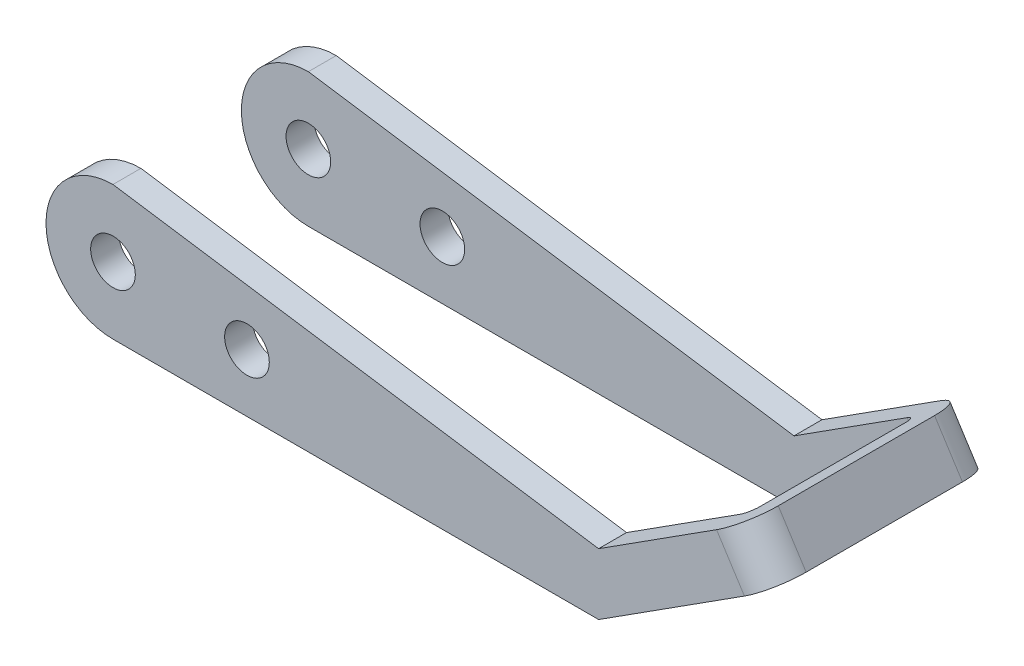
ISO-10303-21;
HEADER;
FILE_DESCRIPTION(('STEP AP214'),'2;1');
FILE_NAME('part.step','',(''),(''),'','','');
FILE_SCHEMA(('AUTOMOTIVE_DESIGN { 1 0 10303 214 1 1 1 1 }'));
ENDSEC;
DATA;
#1=APPLICATION_CONTEXT('core data for automotive mechanical design processes');
#2=APPLICATION_PROTOCOL_DEFINITION('international standard','automotive_design',2000,#1);
#3=PRODUCT_CONTEXT('',#1,'mechanical');
#4=PRODUCT('Part','Part','',(#3));
#5=PRODUCT_RELATED_PRODUCT_CATEGORY('part','',(#4));
#6=PRODUCT_DEFINITION_FORMATION('','',#4);
#7=PRODUCT_DEFINITION_CONTEXT('part definition',#1,'design');
#8=PRODUCT_DEFINITION('design','',#6,#7);
#9=PRODUCT_DEFINITION_SHAPE('','',#8);
#10=(LENGTH_UNIT() NAMED_UNIT(*) SI_UNIT(.MILLI.,.METRE.));
#11=(NAMED_UNIT(*) PLANE_ANGLE_UNIT() SI_UNIT($,.RADIAN.));
#12=(NAMED_UNIT(*) SI_UNIT($,.STERADIAN.) SOLID_ANGLE_UNIT());
#13=UNCERTAINTY_MEASURE_WITH_UNIT(LENGTH_MEASURE(1.E-05),#10,'distance_accuracy_value','');
#14=(GEOMETRIC_REPRESENTATION_CONTEXT(3) GLOBAL_UNCERTAINTY_ASSIGNED_CONTEXT((#13)) GLOBAL_UNIT_ASSIGNED_CONTEXT((#10,
#11,#12)) REPRESENTATION_CONTEXT('',''));
#15=CARTESIAN_POINT('',(0.,0.,0.));
#16=DIRECTION('',(0.,0.,1.));
#17=DIRECTION('',(1.,0.,0.));
#18=AXIS2_PLACEMENT_3D('',#15,#16,#17);
#19=CARTESIAN_POINT('',(54.4833579873411,6.52303191660795,-7.5));
#20=DIRECTION('',(0.842452397007147,0.538770785006864,0.));
#21=DIRECTION('',(-0.538770785006864,0.842452397007147,0.));
#22=AXIS2_PLACEMENT_3D('',#19,#20,#21);
#23=PLANE('',#22);
#24=DIRECTION('',(-0.538770785006864,0.842452397007147,0.));
#25=VECTOR('',#24,1.);
#26=CARTESIAN_POINT('',(56.9792383521143,2.62033256010983,-1.));
#27=LINE('',#26,#25);
#28=CARTESIAN_POINT('',(56.9792383521143,2.62033256010983,-1.));
#29=VERTEX_POINT('',#28);
#30=CARTESIAN_POINT('',(54.4833579873411,6.52303191660795,-1.));
#31=VERTEX_POINT('',#30);
#32=EDGE_CURVE('E228',#29,#31,#27,.T.);
#33=ORIENTED_EDGE('',*,*,#32,.T.);
#34=DIRECTION('',(0.,0.,1.));
#35=VECTOR('',#34,1.);
#36=CARTESIAN_POINT('',(54.4833579873411,6.52303191660795,-7.5));
#37=LINE('',#36,#35);
#38=CARTESIAN_POINT('',(54.4833579873411,6.52303191660795,-14.));
#39=VERTEX_POINT('',#38);
#40=EDGE_CURVE('E247',#39,#31,#37,.T.);
#41=ORIENTED_EDGE('',*,*,#40,.F.);
#42=DIRECTION('',(-0.538770785006864,0.842452397007147,0.));
#43=VECTOR('',#42,1.);
#44=CARTESIAN_POINT('',(56.9792383521143,2.62033256010983,-14.));
#45=LINE('',#44,#43);
#46=CARTESIAN_POINT('',(56.9792383521143,2.62033256010983,-14.));
#47=VERTEX_POINT('',#46);
#48=EDGE_CURVE('E186',#47,#39,#45,.T.);
#49=ORIENTED_EDGE('',*,*,#48,.F.);
#50=DIRECTION('',(0.,0.,1.));
#51=VECTOR('',#50,1.);
#52=CARTESIAN_POINT('',(56.9792383521143,2.62033256010982,-7.5));
#53=LINE('',#52,#51);
#54=EDGE_CURVE('E171',#47,#29,#53,.T.);
#55=ORIENTED_EDGE('',*,*,#54,.T.);
#56=EDGE_LOOP('',(#33,#41,#49,#55));
#57=FACE_BOUND('',#56,.T.);
#58=ADVANCED_FACE('F39',(#57),#23,.F.);
#59=CARTESIAN_POINT('',(0.,0.,0.));
#60=DIRECTION('',(0.,0.,1.));
#61=DIRECTION('',(1.,0.,0.));
#62=AXIS2_PLACEMENT_3D('',#59,#60,#61);
#63=PLANE('',#62);
#64=CARTESIAN_POINT('',(12.,-0.8,0.));
#65=DIRECTION('',(0.,0.,1.));
#66=DIRECTION('',(1.,0.,0.));
#67=AXIS2_PLACEMENT_3D('',#64,#65,#66);
#68=CIRCLE('',#67,2.);
#69=CARTESIAN_POINT('',(14.,-0.8,0.));
#70=VERTEX_POINT('',#69);
#71=EDGE_CURVE('E253',#70,#70,#68,.T.);
#72=ORIENTED_EDGE('',*,*,#71,.T.);
#73=EDGE_LOOP('',(#72));
#74=FACE_BOUND('',#73,.T.);
#75=CARTESIAN_POINT('',(0.,0.,0.));
#76=DIRECTION('',(0.,0.,1.));
#77=DIRECTION('',(1.,0.,0.));
#78=AXIS2_PLACEMENT_3D('',#75,#76,#77);
#79=CIRCLE('',#78,2.);
#80=CARTESIAN_POINT('',(2.,0.,0.));
#81=VERTEX_POINT('',#80);
#82=EDGE_CURVE('E258',#81,#81,#79,.T.);
#83=ORIENTED_EDGE('',*,*,#82,.T.);
#84=EDGE_LOOP('',(#83));
#85=FACE_BOUND('',#84,.T.);
#86=DIRECTION('',(-0.842452397007147,-0.538770785006864,0.));
#87=VECTOR('',#86,1.);
#88=CARTESIAN_POINT('',(43.5,-0.501118558687071,0.));
#89=LINE('',#88,#87);
#90=CARTESIAN_POINT('',(53.640905590334,5.98426113160109,0.));
#91=VERTEX_POINT('',#90);
#92=CARTESIAN_POINT('',(43.5,-0.501118558687071,0.));
#93=VERTEX_POINT('',#92);
#94=EDGE_CURVE('E295',#91,#93,#89,.T.);
#95=ORIENTED_EDGE('',*,*,#94,.F.);
#96=DIRECTION('',(-0.538770785006864,0.842452397007147,0.));
#97=VECTOR('',#96,1.);
#98=CARTESIAN_POINT('',(56.1367859551072,2.08156177510296,0.));
#99=LINE('',#98,#97);
#100=CARTESIAN_POINT('',(56.1367859551072,2.08156177510296,0.));
#101=VERTEX_POINT('',#100);
#102=EDGE_CURVE('E224',#101,#91,#99,.T.);
#103=ORIENTED_EDGE('',*,*,#102,.F.);
#104=DIRECTION('',(0.842452397007147,0.538770785006864,0.));
#105=VECTOR('',#104,1.);
#106=CARTESIAN_POINT('',(43.5,-6.,0.));
#107=LINE('',#106,#105);
#108=CARTESIAN_POINT('',(43.5,-6.,0.));
#109=VERTEX_POINT('',#108);
#110=EDGE_CURVE('E291',#109,#101,#107,.T.);
#111=ORIENTED_EDGE('',*,*,#110,.F.);
#112=DIRECTION('',(1.,0.,0.));
#113=VECTOR('',#112,1.);
#114=CARTESIAN_POINT('',(0.,-6.,0.));
#115=LINE('',#114,#113);
#116=CARTESIAN_POINT('',(0.,-6.,0.));
#117=VERTEX_POINT('',#116);
#118=EDGE_CURVE('E288',#117,#109,#115,.T.);
#119=ORIENTED_EDGE('',*,*,#118,.F.);
#120=CARTESIAN_POINT('',(0.,0.,0.));
#121=DIRECTION('',(0.,0.,1.));
#122=DIRECTION('',(1.,0.,0.));
#123=AXIS2_PLACEMENT_3D('',#120,#121,#122);
#124=CIRCLE('',#123,6.);
#125=CARTESIAN_POINT('',(0.,6.,0.));
#126=VERTEX_POINT('',#125);
#127=EDGE_CURVE('E266',#126,#117,#124,.T.);
#128=ORIENTED_EDGE('',*,*,#127,.F.);
#129=DIRECTION('',(-0.989015863361917,0.147809411129611,0.));
#130=VECTOR('',#129,1.);
#131=CARTESIAN_POINT('',(0.,6.,0.));
#132=LINE('',#131,#130);
#133=EDGE_CURVE('E85',#93,#126,#132,.T.);
#134=ORIENTED_EDGE('',*,*,#133,.F.);
#135=EDGE_LOOP('',(#95,#103,#111,#119,#128,#134));
#136=FACE_BOUND('',#135,.T.);
#137=ADVANCED_FACE('F317',(#74,#85,#136),#63,.F.);
#138=CARTESIAN_POINT('',(0.,0.,2.5));
#139=DIRECTION('',(0.,0.,1.));
#140=DIRECTION('',(1.,0.,0.));
#141=AXIS2_PLACEMENT_3D('',#138,#139,#140);
#142=PLANE('',#141);
#143=DIRECTION('',(-0.538770785006864,0.842452397007147,0.));
#144=VECTOR('',#143,1.);
#145=CARTESIAN_POINT('',(61.0820390122775,-4.72307647523078,2.5));
#146=LINE('',#145,#144);
#147=CARTESIAN_POINT('',(56.5580121536108,2.35094716760639,2.5));
#148=VERTEX_POINT('',#147);
#149=CARTESIAN_POINT('',(54.0621317888375,6.25364652410452,2.5));
#150=VERTEX_POINT('',#149);
#151=EDGE_CURVE('E237',#148,#150,#146,.T.);
#152=ORIENTED_EDGE('',*,*,#151,.T.);
#153=DIRECTION('',(-0.842452397007147,-0.538770785006864,0.));
#154=VECTOR('',#153,1.);
#155=CARTESIAN_POINT('',(43.5,-0.501118558687071,2.5));
#156=LINE('',#155,#154);
#157=CARTESIAN_POINT('',(43.5,-0.501118558687071,2.5));
#158=VERTEX_POINT('',#157);
#159=EDGE_CURVE('E279',#150,#158,#156,.T.);
#160=ORIENTED_EDGE('',*,*,#159,.T.);
#161=DIRECTION('',(-0.989015863361917,0.147809411129611,0.));
#162=VECTOR('',#161,1.);
#163=CARTESIAN_POINT('',(0.,6.,2.5));
#164=LINE('',#163,#162);
#165=CARTESIAN_POINT('',(0.,6.,2.5));
#166=VERTEX_POINT('',#165);
#167=EDGE_CURVE('E64',#158,#166,#164,.T.);
#168=ORIENTED_EDGE('',*,*,#167,.T.);
#169=CARTESIAN_POINT('',(0.,0.,2.5));
#170=DIRECTION('',(0.,0.,1.));
#171=DIRECTION('',(1.,0.,0.));
#172=AXIS2_PLACEMENT_3D('',#169,#170,#171);
#173=CIRCLE('',#172,6.);
#174=CARTESIAN_POINT('',(0.,-6.,2.5));
#175=VERTEX_POINT('',#174);
#176=EDGE_CURVE('E270',#166,#175,#173,.T.);
#177=ORIENTED_EDGE('',*,*,#176,.T.);
#178=DIRECTION('',(1.,0.,0.));
#179=VECTOR('',#178,1.);
#180=CARTESIAN_POINT('',(0.,-6.,2.5));
#181=LINE('',#180,#179);
#182=CARTESIAN_POINT('',(43.5,-6.,2.5));
#183=VERTEX_POINT('',#182);
#184=EDGE_CURVE('E92',#175,#183,#181,.T.);
#185=ORIENTED_EDGE('',*,*,#184,.T.);
#186=DIRECTION('',(0.842452397007147,0.538770785006864,0.));
#187=VECTOR('',#186,1.);
#188=CARTESIAN_POINT('',(43.5,-6.,2.5));
#189=LINE('',#188,#187);
#190=EDGE_CURVE('E275',#183,#148,#189,.T.);
#191=ORIENTED_EDGE('',*,*,#190,.T.);
#192=EDGE_LOOP('',(#152,#160,#168,#177,#185,#191));
#193=FACE_BOUND('',#192,.T.);
#194=CARTESIAN_POINT('',(0.,0.,2.5));
#195=DIRECTION('',(0.,0.,1.));
#196=DIRECTION('',(1.,0.,0.));
#197=AXIS2_PLACEMENT_3D('',#194,#195,#196);
#198=CIRCLE('',#197,2.);
#199=CARTESIAN_POINT('',(2.,0.,2.5));
#200=VERTEX_POINT('',#199);
#201=EDGE_CURVE('E262',#200,#200,#198,.T.);
#202=ORIENTED_EDGE('',*,*,#201,.F.);
#203=EDGE_LOOP('',(#202));
#204=FACE_BOUND('',#203,.T.);
#205=CARTESIAN_POINT('',(12.,-0.8,2.5));
#206=DIRECTION('',(0.,0.,1.));
#207=DIRECTION('',(1.,0.,0.));
#208=AXIS2_PLACEMENT_3D('',#205,#206,#207);
#209=CIRCLE('',#208,2.);
#210=CARTESIAN_POINT('',(14.,-0.8,2.5));
#211=VERTEX_POINT('',#210);
#212=EDGE_CURVE('E254',#211,#211,#209,.T.);
#213=ORIENTED_EDGE('',*,*,#212,.F.);
#214=EDGE_LOOP('',(#213));
#215=FACE_BOUND('',#214,.T.);
#216=ADVANCED_FACE('F400',(#193,#204,#215),#142,.T.);
#217=CARTESIAN_POINT('',(0.,0.,2.5));
#218=DIRECTION('',(0.,0.,-1.));
#219=DIRECTION('',(-1.,0.,0.));
#220=AXIS2_PLACEMENT_3D('',#217,#218,#219);
#221=CYLINDRICAL_SURFACE('',#220,6.);
#222=ORIENTED_EDGE('',*,*,#127,.T.);
#223=DIRECTION('',(0.,0.,-1.));
#224=VECTOR('',#223,1.);
#225=CARTESIAN_POINT('',(0.,-6.,2.5));
#226=LINE('',#225,#224);
#227=EDGE_CURVE('E11',#175,#117,#226,.T.);
#228=ORIENTED_EDGE('',*,*,#227,.F.);
#229=ORIENTED_EDGE('',*,*,#176,.F.);
#230=DIRECTION('',(0.,0.,-1.));
#231=VECTOR('',#230,1.);
#232=CARTESIAN_POINT('',(0.,6.,2.5));
#233=LINE('',#232,#231);
#234=EDGE_CURVE('E284',#166,#126,#233,.T.);
#235=ORIENTED_EDGE('',*,*,#234,.T.);
#236=EDGE_LOOP('',(#222,#228,#229,#235));
#237=FACE_BOUND('',#236,.T.);
#238=ADVANCED_FACE('F41',(#237),#221,.T.);
#239=CARTESIAN_POINT('',(0.,-6.,2.5));
#240=DIRECTION('',(0.,1.,0.));
#241=DIRECTION('',(0.,0.,1.));
#242=AXIS2_PLACEMENT_3D('',#239,#240,#241);
#243=PLANE('',#242);
#244=ORIENTED_EDGE('',*,*,#118,.T.);
#245=DIRECTION('',(0.,0.,-1.));
#246=VECTOR('',#245,1.);
#247=CARTESIAN_POINT('',(43.5,-6.,2.5));
#248=LINE('',#247,#246);
#249=EDGE_CURVE('E48',#183,#109,#248,.T.);
#250=ORIENTED_EDGE('',*,*,#249,.F.);
#251=ORIENTED_EDGE('',*,*,#184,.F.);
#252=ORIENTED_EDGE('',*,*,#227,.T.);
#253=EDGE_LOOP('',(#244,#250,#251,#252));
#254=FACE_BOUND('',#253,.T.);
#255=ADVANCED_FACE('F406',(#254),#243,.F.);
#256=CARTESIAN_POINT('',(43.5,-6.,2.5));
#257=DIRECTION('',(-0.538770785006864,0.842452397007147,0.));
#258=DIRECTION('',(-0.842452397007147,-0.538770785006864,0.));
#259=AXIS2_PLACEMENT_3D('',#256,#257,#258);
#260=PLANE('',#259);
#261=DIRECTION('',(0.,0.,-1.));
#262=VECTOR('',#261,1.);
#263=CARTESIAN_POINT('',(59.0853693446322,3.96725952262698,2.5));
#264=LINE('',#263,#262);
#265=CARTESIAN_POINT('',(59.0853693446322,3.96725952262698,-0.5));
#266=VERTEX_POINT('',#265);
#267=CARTESIAN_POINT('',(59.0853693446322,3.96725952262698,-14.5));
#268=VERTEX_POINT('',#267);
#269=EDGE_CURVE('E308',#266,#268,#264,.T.);
#270=ORIENTED_EDGE('',*,*,#269,.F.);
#271=CARTESIAN_POINT('',(56.5580121536108,2.35094716760639,-0.5));
#272=DIRECTION('',(-0.538770785006864,0.842452397007147,0.));
#273=DIRECTION('',(-0.842452397007147,-0.538770785006864,0.));
#274=AXIS2_PLACEMENT_3D('',#271,#272,#273);
#275=CIRCLE('',#274,3.);
#276=EDGE_CURVE('E240',#266,#148,#275,.F.);
#277=ORIENTED_EDGE('',*,*,#276,.T.);
#278=ORIENTED_EDGE('',*,*,#190,.F.);
#279=ORIENTED_EDGE('',*,*,#249,.T.);
#280=ORIENTED_EDGE('',*,*,#110,.T.);
#281=CARTESIAN_POINT('',(56.1367859551072,2.08156177510296,-1.));
#282=DIRECTION('',(0.538770785006864,-0.842452397007147,0.));
#283=DIRECTION('',(-0.842452397007147,-0.538770785006864,0.));
#284=AXIS2_PLACEMENT_3D('',#281,#282,#283);
#285=CIRCLE('',#284,0.999999999999997);
#286=EDGE_CURVE('E221',#29,#101,#285,.T.);
#287=ORIENTED_EDGE('',*,*,#286,.F.);
#288=ORIENTED_EDGE('',*,*,#54,.F.);
#289=CARTESIAN_POINT('',(56.1367859551072,2.08156177510296,-14.));
#290=DIRECTION('',(-0.538770785006864,0.842452397007147,0.));
#291=DIRECTION('',(-0.842452397007147,-0.538770785006864,0.));
#292=AXIS2_PLACEMENT_3D('',#289,#290,#291);
#293=CIRCLE('',#292,0.999999999999997);
#294=CARTESIAN_POINT('',(56.1367859551072,2.08156177510296,-15.));
#295=VERTEX_POINT('',#294);
#296=EDGE_CURVE('E162',#47,#295,#293,.T.);
#297=ORIENTED_EDGE('',*,*,#296,.T.);
#298=DIRECTION('',(0.842452397007147,0.538770785006864,0.));
#299=VECTOR('',#298,1.);
#300=CARTESIAN_POINT('',(43.5,-6.,-15.));
#301=LINE('',#300,#299);
#302=CARTESIAN_POINT('',(43.5,-6.,-15.));
#303=VERTEX_POINT('',#302);
#304=EDGE_CURVE('E167',#303,#295,#301,.T.);
#305=ORIENTED_EDGE('',*,*,#304,.F.);
#306=DIRECTION('',(0.,0.,1.));
#307=VECTOR('',#306,1.);
#308=CARTESIAN_POINT('',(43.5,-6.,-17.5));
#309=LINE('',#308,#307);
#310=CARTESIAN_POINT('',(43.5,-6.,-17.5));
#311=VERTEX_POINT('',#310);
#312=EDGE_CURVE('E214',#311,#303,#309,.T.);
#313=ORIENTED_EDGE('',*,*,#312,.F.);
#314=DIRECTION('',(0.842452397007147,0.538770785006864,0.));
#315=VECTOR('',#314,1.);
#316=CARTESIAN_POINT('',(43.5,-6.,-17.5));
#317=LINE('',#316,#315);
#318=CARTESIAN_POINT('',(56.5580121536108,2.35094716760639,-17.5));
#319=VERTEX_POINT('',#318);
#320=EDGE_CURVE('E366',#311,#319,#317,.T.);
#321=ORIENTED_EDGE('',*,*,#320,.T.);
#322=CARTESIAN_POINT('',(56.5580121536108,2.35094716760639,-14.5));
#323=DIRECTION('',(0.538770785006864,-0.842452397007147,0.));
#324=DIRECTION('',(-0.842452397007147,-0.538770785006864,0.));
#325=AXIS2_PLACEMENT_3D('',#322,#323,#324);
#326=CIRCLE('',#325,3.);
#327=EDGE_CURVE('E337',#268,#319,#326,.F.);
#328=ORIENTED_EDGE('',*,*,#327,.F.);
#329=EDGE_LOOP('',(#270,#277,#278,#279,#280,#287,#288,#297,#305,#313,#321,#328));
#330=FACE_BOUND('',#329,.T.);
#331=ADVANCED_FACE('F165',(#330),#260,.F.);
#332=CARTESIAN_POINT('',(56.589488979859,7.86995887912511,2.5));
#333=DIRECTION('',(-0.842452397007147,-0.538770785006864,0.));
#334=DIRECTION('',(0.538770785006864,-0.842452397007147,0.));
#335=AXIS2_PLACEMENT_3D('',#332,#333,#334);
#336=PLANE('',#335);
#337=DIRECTION('',(0.,0.,-1.));
#338=VECTOR('',#337,1.);
#339=CARTESIAN_POINT('',(56.589488979859,7.86995887912511,2.5));
#340=LINE('',#339,#338);
#341=CARTESIAN_POINT('',(56.589488979859,7.86995887912511,-0.5));
#342=VERTEX_POINT('',#341);
#343=CARTESIAN_POINT('',(56.589488979859,7.86995887912511,-14.5));
#344=VERTEX_POINT('',#343);
#345=EDGE_CURVE('E305',#342,#344,#340,.T.);
#346=ORIENTED_EDGE('',*,*,#345,.F.);
#347=DIRECTION('',(-0.538770785006864,0.842452397007147,0.));
#348=VECTOR('',#347,1.);
#349=CARTESIAN_POINT('',(63.6093962032989,-3.10676412021019,-0.5));
#350=LINE('',#349,#348);
#351=EDGE_CURVE('E55',#266,#342,#350,.T.);
#352=ORIENTED_EDGE('',*,*,#351,.F.);
#353=ORIENTED_EDGE('',*,*,#269,.T.);
#354=DIRECTION('',(-0.538770785006864,0.842452397007147,0.));
#355=VECTOR('',#354,1.);
#356=CARTESIAN_POINT('',(63.6093962032989,-3.10676412021019,-14.5));
#357=LINE('',#356,#355);
#358=EDGE_CURVE('E333',#268,#344,#357,.T.);
#359=ORIENTED_EDGE('',*,*,#358,.T.);
#360=EDGE_LOOP('',(#346,#352,#353,#359));
#361=FACE_BOUND('',#360,.T.);
#362=ADVANCED_FACE('F399',(#361),#336,.F.);
#363=CARTESIAN_POINT('',(43.5,-0.501118558687071,2.5));
#364=DIRECTION('',(0.538770785006864,-0.842452397007147,0.));
#365=DIRECTION('',(0.842452397007147,0.538770785006864,0.));
#366=AXIS2_PLACEMENT_3D('',#363,#364,#365);
#367=PLANE('',#366);
#368=CARTESIAN_POINT('',(53.640905590334,5.98426113160109,-1.));
#369=DIRECTION('',(0.538770785006864,-0.842452397007147,0.));
#370=DIRECTION('',(-0.842452397007147,-0.538770785006864,0.));
#371=AXIS2_PLACEMENT_3D('',#368,#369,#370);
#372=CIRCLE('',#371,0.999999999999997);
#373=EDGE_CURVE('E220',#31,#91,#372,.T.);
#374=ORIENTED_EDGE('',*,*,#373,.T.);
#375=ORIENTED_EDGE('',*,*,#94,.T.);
#376=DIRECTION('',(0.,0.,-1.));
#377=VECTOR('',#376,1.);
#378=CARTESIAN_POINT('',(43.5,-0.501118558687071,2.5));
#379=LINE('',#378,#377);
#380=EDGE_CURVE('E302',#158,#93,#379,.T.);
#381=ORIENTED_EDGE('',*,*,#380,.F.);
#382=ORIENTED_EDGE('',*,*,#159,.F.);
#383=CARTESIAN_POINT('',(54.0621317888375,6.25364652410452,-0.5));
#384=DIRECTION('',(0.538770785006864,-0.842452397007147,0.));
#385=DIRECTION('',(-0.842452397007147,-0.538770785006864,0.));
#386=AXIS2_PLACEMENT_3D('',#383,#384,#385);
#387=CIRCLE('',#386,3.);
#388=EDGE_CURVE('E232',#342,#150,#387,.T.);
#389=ORIENTED_EDGE('',*,*,#388,.F.);
#390=ORIENTED_EDGE('',*,*,#345,.T.);
#391=CARTESIAN_POINT('',(54.0621317888375,6.25364652410452,-14.5));
#392=DIRECTION('',(-0.538770785006864,0.842452397007147,0.));
#393=DIRECTION('',(-0.842452397007147,-0.538770785006864,0.));
#394=AXIS2_PLACEMENT_3D('',#391,#392,#393);
#395=CIRCLE('',#394,3.);
#396=CARTESIAN_POINT('',(54.0621317888375,6.25364652410452,-17.5));
#397=VERTEX_POINT('',#396);
#398=EDGE_CURVE('E326',#344,#397,#395,.T.);
#399=ORIENTED_EDGE('',*,*,#398,.T.);
#400=DIRECTION('',(-0.842452397007147,-0.538770785006864,0.));
#401=VECTOR('',#400,1.);
#402=CARTESIAN_POINT('',(43.5,-0.501118558687071,-17.5));
#403=LINE('',#402,#401);
#404=CARTESIAN_POINT('',(43.5,-0.501118558687071,-17.5));
#405=VERTEX_POINT('',#404);
#406=EDGE_CURVE('E370',#397,#405,#403,.T.);
#407=ORIENTED_EDGE('',*,*,#406,.T.);
#408=DIRECTION('',(0.,0.,1.));
#409=VECTOR('',#408,1.);
#410=CARTESIAN_POINT('',(43.5,-0.501118558687071,-17.5));
#411=LINE('',#410,#409);
#412=CARTESIAN_POINT('',(43.5,-0.501118558687071,-15.));
#413=VERTEX_POINT('',#412);
#414=EDGE_CURVE('E210',#405,#413,#411,.T.);
#415=ORIENTED_EDGE('',*,*,#414,.T.);
#416=DIRECTION('',(-0.842452397007147,-0.538770785006864,0.));
#417=VECTOR('',#416,1.);
#418=CARTESIAN_POINT('',(43.5,-0.501118558687071,-15.));
#419=LINE('',#418,#417);
#420=CARTESIAN_POINT('',(53.640905590334,5.98426113160109,-15.));
#421=VERTEX_POINT('',#420);
#422=EDGE_CURVE('E193',#421,#413,#419,.T.);
#423=ORIENTED_EDGE('',*,*,#422,.F.);
#424=CARTESIAN_POINT('',(53.640905590334,5.98426113160109,-14.));
#425=DIRECTION('',(-0.538770785006864,0.842452397007147,0.));
#426=DIRECTION('',(-0.842452397007147,-0.538770785006864,0.));
#427=AXIS2_PLACEMENT_3D('',#424,#425,#426);
#428=CIRCLE('',#427,0.999999999999997);
#429=EDGE_CURVE('E177',#39,#421,#428,.T.);
#430=ORIENTED_EDGE('',*,*,#429,.F.);
#431=ORIENTED_EDGE('',*,*,#40,.T.);
#432=EDGE_LOOP('',(#374,#375,#381,#382,#389,#390,#399,#407,#415,#423,#430,#431));
#433=FACE_BOUND('',#432,.T.);
#434=ADVANCED_FACE('F322',(#433),#367,.F.);
#435=CARTESIAN_POINT('',(0.,6.,2.5));
#436=DIRECTION('',(-0.147809411129611,-0.989015863361917,0.));
#437=DIRECTION('',(0.989015863361917,-0.147809411129611,0.));
#438=AXIS2_PLACEMENT_3D('',#435,#436,#437);
#439=PLANE('',#438);
#440=ORIENTED_EDGE('',*,*,#133,.T.);
#441=ORIENTED_EDGE('',*,*,#234,.F.);
#442=ORIENTED_EDGE('',*,*,#167,.F.);
#443=ORIENTED_EDGE('',*,*,#380,.T.);
#444=EDGE_LOOP('',(#440,#441,#442,#443));
#445=FACE_BOUND('',#444,.T.);
#446=ADVANCED_FACE('F431',(#445),#439,.F.);
#447=CARTESIAN_POINT('',(0.,0.,2.5));
#448=DIRECTION('',(0.,0.,-1.));
#449=DIRECTION('',(-1.,0.,0.));
#450=AXIS2_PLACEMENT_3D('',#447,#448,#449);
#451=CYLINDRICAL_SURFACE('',#450,2.);
#452=ORIENTED_EDGE('',*,*,#201,.T.);
#453=EDGE_LOOP('',(#452));
#454=FACE_BOUND('',#453,.T.);
#455=ORIENTED_EDGE('',*,*,#82,.F.);
#456=EDGE_LOOP('',(#455));
#457=FACE_BOUND('',#456,.T.);
#458=ADVANCED_FACE('F427',(#454,#457),#451,.F.);
#459=CARTESIAN_POINT('',(12.,-0.8,2.5));
#460=DIRECTION('',(0.,0.,-1.));
#461=DIRECTION('',(-1.,0.,0.));
#462=AXIS2_PLACEMENT_3D('',#459,#460,#461);
#463=CYLINDRICAL_SURFACE('',#462,2.);
#464=ORIENTED_EDGE('',*,*,#212,.T.);
#465=EDGE_LOOP('',(#464));
#466=FACE_BOUND('',#465,.T.);
#467=ORIENTED_EDGE('',*,*,#71,.F.);
#468=EDGE_LOOP('',(#467));
#469=FACE_BOUND('',#468,.T.);
#470=ADVANCED_FACE('F424',(#466,#469),#463,.F.);
#471=CARTESIAN_POINT('',(61.0820390122775,-4.72307647523078,-0.5));
#472=DIRECTION('',(-0.538770785006864,0.842452397007147,0.));
#473=DIRECTION('',(-0.842452397007147,-0.538770785006864,0.));
#474=AXIS2_PLACEMENT_3D('',#471,#472,#473);
#475=CYLINDRICAL_SURFACE('',#474,3.);
#476=ORIENTED_EDGE('',*,*,#351,.T.);
#477=ORIENTED_EDGE('',*,*,#388,.T.);
#478=ORIENTED_EDGE('',*,*,#151,.F.);
#479=ORIENTED_EDGE('',*,*,#276,.F.);
#480=EDGE_LOOP('',(#476,#477,#478,#479));
#481=FACE_BOUND('',#480,.T.);
#482=ADVANCED_FACE('F422',(#481),#475,.T.);
#483=CARTESIAN_POINT('',(56.1367859551072,2.08156177510296,-1.));
#484=DIRECTION('',(-0.538770785006864,0.842452397007147,0.));
#485=DIRECTION('',(-0.842452397007147,-0.538770785006864,0.));
#486=AXIS2_PLACEMENT_3D('',#483,#484,#485);
#487=CYLINDRICAL_SURFACE('',#486,0.999999999999997);
#488=ORIENTED_EDGE('',*,*,#373,.F.);
#489=ORIENTED_EDGE('',*,*,#32,.F.);
#490=ORIENTED_EDGE('',*,*,#286,.T.);
#491=ORIENTED_EDGE('',*,*,#102,.T.);
#492=EDGE_LOOP('',(#488,#489,#490,#491));
#493=FACE_BOUND('',#492,.T.);
#494=ADVANCED_FACE('F320',(#493),#487,.F.);
#495=CARTESIAN_POINT('',(0.,0.,-15.));
#496=DIRECTION('',(0.,0.,-1.));
#497=DIRECTION('',(1.,0.,0.));
#498=AXIS2_PLACEMENT_3D('',#495,#496,#497);
#499=PLANE('',#498);
#500=CARTESIAN_POINT('',(12.,-0.8,-15.));
#501=DIRECTION('',(0.,0.,1.));
#502=DIRECTION('',(1.,0.,0.));
#503=AXIS2_PLACEMENT_3D('',#500,#501,#502);
#504=CIRCLE('',#503,2.);
#505=CARTESIAN_POINT('',(14.,-0.8,-15.));
#506=VERTEX_POINT('',#505);
#507=EDGE_CURVE('E343',#506,#506,#504,.T.);
#508=ORIENTED_EDGE('',*,*,#507,.F.);
#509=EDGE_LOOP('',(#508));
#510=FACE_BOUND('',#509,.T.);
#511=CARTESIAN_POINT('',(0.,0.,-15.));
#512=DIRECTION('',(0.,0.,1.));
#513=DIRECTION('',(1.,0.,0.));
#514=AXIS2_PLACEMENT_3D('',#511,#512,#513);
#515=CIRCLE('',#514,2.);
#516=CARTESIAN_POINT('',(2.,0.,-15.));
#517=VERTEX_POINT('',#516);
#518=EDGE_CURVE('E348',#517,#517,#515,.T.);
#519=ORIENTED_EDGE('',*,*,#518,.F.);
#520=EDGE_LOOP('',(#519));
#521=FACE_BOUND('',#520,.T.);
#522=ORIENTED_EDGE('',*,*,#422,.T.);
#523=DIRECTION('',(-0.989015863361917,0.147809411129611,0.));
#524=VECTOR('',#523,1.);
#525=CARTESIAN_POINT('',(0.,6.,-15.));
#526=LINE('',#525,#524);
#527=CARTESIAN_POINT('',(0.,6.,-15.));
#528=VERTEX_POINT('',#527);
#529=EDGE_CURVE('E197',#413,#528,#526,.T.);
#530=ORIENTED_EDGE('',*,*,#529,.T.);
#531=CARTESIAN_POINT('',(0.,0.,-15.));
#532=DIRECTION('',(0.,0.,1.));
#533=DIRECTION('',(1.,0.,0.));
#534=AXIS2_PLACEMENT_3D('',#531,#532,#533);
#535=CIRCLE('',#534,6.);
#536=CARTESIAN_POINT('',(0.,-6.,-15.));
#537=VERTEX_POINT('',#536);
#538=EDGE_CURVE('E199',#528,#537,#535,.T.);
#539=ORIENTED_EDGE('',*,*,#538,.T.);
#540=DIRECTION('',(1.,0.,0.));
#541=VECTOR('',#540,1.);
#542=CARTESIAN_POINT('',(0.,-6.,-15.));
#543=LINE('',#542,#541);
#544=EDGE_CURVE('E191',#537,#303,#543,.T.);
#545=ORIENTED_EDGE('',*,*,#544,.T.);
#546=ORIENTED_EDGE('',*,*,#304,.T.);
#547=DIRECTION('',(-0.538770785006864,0.842452397007147,0.));
#548=VECTOR('',#547,1.);
#549=CARTESIAN_POINT('',(56.1367859551072,2.08156177510296,-15.));
#550=LINE('',#549,#548);
#551=EDGE_CURVE('E176',#295,#421,#550,.T.);
#552=ORIENTED_EDGE('',*,*,#551,.T.);
#553=EDGE_LOOP('',(#522,#530,#539,#545,#546,#552));
#554=FACE_BOUND('',#553,.T.);
#555=ADVANCED_FACE('F188',(#510,#521,#554),#499,.F.);
#556=CARTESIAN_POINT('',(0.,0.,-17.5));
#557=DIRECTION('',(0.,0.,-1.));
#558=DIRECTION('',(1.,0.,0.));
#559=AXIS2_PLACEMENT_3D('',#556,#557,#558);
#560=PLANE('',#559);
#561=DIRECTION('',(-0.538770785006864,0.842452397007147,0.));
#562=VECTOR('',#561,1.);
#563=CARTESIAN_POINT('',(61.0820390122775,-4.72307647523078,-17.5));
#564=LINE('',#563,#562);
#565=EDGE_CURVE('E329',#319,#397,#564,.T.);
#566=ORIENTED_EDGE('',*,*,#565,.F.);
#567=ORIENTED_EDGE('',*,*,#320,.F.);
#568=DIRECTION('',(1.,0.,0.));
#569=VECTOR('',#568,1.);
#570=CARTESIAN_POINT('',(0.,-6.,-17.5));
#571=LINE('',#570,#569);
#572=CARTESIAN_POINT('',(0.,-6.,-17.5));
#573=VERTEX_POINT('',#572);
#574=EDGE_CURVE('E362',#573,#311,#571,.T.);
#575=ORIENTED_EDGE('',*,*,#574,.F.);
#576=CARTESIAN_POINT('',(0.,0.,-17.5));
#577=DIRECTION('',(0.,0.,1.));
#578=DIRECTION('',(1.,0.,0.));
#579=AXIS2_PLACEMENT_3D('',#576,#577,#578);
#580=CIRCLE('',#579,6.);
#581=CARTESIAN_POINT('',(0.,6.,-17.5));
#582=VERTEX_POINT('',#581);
#583=EDGE_CURVE('E206',#582,#573,#580,.T.);
#584=ORIENTED_EDGE('',*,*,#583,.F.);
#585=DIRECTION('',(-0.989015863361917,0.147809411129611,0.));
#586=VECTOR('',#585,1.);
#587=CARTESIAN_POINT('',(0.,6.,-17.5));
#588=LINE('',#587,#586);
#589=EDGE_CURVE('E211',#405,#582,#588,.T.);
#590=ORIENTED_EDGE('',*,*,#589,.F.);
#591=ORIENTED_EDGE('',*,*,#406,.F.);
#592=EDGE_LOOP('',(#566,#567,#575,#584,#590,#591));
#593=FACE_BOUND('',#592,.T.);
#594=CARTESIAN_POINT('',(0.,0.,-17.5));
#595=DIRECTION('',(0.,0.,1.));
#596=DIRECTION('',(1.,0.,0.));
#597=AXIS2_PLACEMENT_3D('',#594,#595,#596);
#598=CIRCLE('',#597,2.);
#599=CARTESIAN_POINT('',(2.,0.,-17.5));
#600=VERTEX_POINT('',#599);
#601=EDGE_CURVE('E352',#600,#600,#598,.T.);
#602=ORIENTED_EDGE('',*,*,#601,.T.);
#603=EDGE_LOOP('',(#602));
#604=FACE_BOUND('',#603,.T.);
#605=CARTESIAN_POINT('',(12.,-0.8,-17.5));
#606=DIRECTION('',(0.,0.,1.));
#607=DIRECTION('',(1.,0.,0.));
#608=AXIS2_PLACEMENT_3D('',#605,#606,#607);
#609=CIRCLE('',#608,2.);
#610=CARTESIAN_POINT('',(14.,-0.8,-17.5));
#611=VERTEX_POINT('',#610);
#612=EDGE_CURVE('E344',#611,#611,#609,.T.);
#613=ORIENTED_EDGE('',*,*,#612,.T.);
#614=EDGE_LOOP('',(#613));
#615=FACE_BOUND('',#614,.T.);
#616=ADVANCED_FACE('F390',(#593,#604,#615),#560,.T.);
#617=CARTESIAN_POINT('',(0.,0.,-17.5));
#618=DIRECTION('',(0.,0.,1.));
#619=DIRECTION('',(-1.,0.,0.));
#620=AXIS2_PLACEMENT_3D('',#617,#618,#619);
#621=CYLINDRICAL_SURFACE('',#620,6.);
#622=ORIENTED_EDGE('',*,*,#538,.F.);
#623=DIRECTION('',(0.,0.,1.));
#624=VECTOR('',#623,1.);
#625=CARTESIAN_POINT('',(0.,6.,-17.5));
#626=LINE('',#625,#624);
#627=EDGE_CURVE('E207',#582,#528,#626,.T.);
#628=ORIENTED_EDGE('',*,*,#627,.F.);
#629=ORIENTED_EDGE('',*,*,#583,.T.);
#630=DIRECTION('',(0.,0.,1.));
#631=VECTOR('',#630,1.);
#632=CARTESIAN_POINT('',(0.,-6.,-17.5));
#633=LINE('',#632,#631);
#634=EDGE_CURVE('E217',#573,#537,#633,.T.);
#635=ORIENTED_EDGE('',*,*,#634,.T.);
#636=EDGE_LOOP('',(#622,#628,#629,#635));
#637=FACE_BOUND('',#636,.T.);
#638=ADVANCED_FACE('F380',(#637),#621,.T.);
#639=CARTESIAN_POINT('',(0.,-6.,-17.5));
#640=DIRECTION('',(0.,1.,0.));
#641=DIRECTION('',(0.,0.,-1.));
#642=AXIS2_PLACEMENT_3D('',#639,#640,#641);
#643=PLANE('',#642);
#644=ORIENTED_EDGE('',*,*,#544,.F.);
#645=ORIENTED_EDGE('',*,*,#634,.F.);
#646=ORIENTED_EDGE('',*,*,#574,.T.);
#647=ORIENTED_EDGE('',*,*,#312,.T.);
#648=EDGE_LOOP('',(#644,#645,#646,#647));
#649=FACE_BOUND('',#648,.T.);
#650=ADVANCED_FACE('F384',(#649),#643,.F.);
#651=CARTESIAN_POINT('',(0.,6.,-17.5));
#652=DIRECTION('',(-0.147809411129611,-0.989015863361917,0.));
#653=DIRECTION('',(0.989015863361917,-0.147809411129611,0.));
#654=AXIS2_PLACEMENT_3D('',#651,#652,#653);
#655=PLANE('',#654);
#656=ORIENTED_EDGE('',*,*,#529,.F.);
#657=ORIENTED_EDGE('',*,*,#414,.F.);
#658=ORIENTED_EDGE('',*,*,#589,.T.);
#659=ORIENTED_EDGE('',*,*,#627,.T.);
#660=EDGE_LOOP('',(#656,#657,#658,#659));
#661=FACE_BOUND('',#660,.T.);
#662=ADVANCED_FACE('F505',(#661),#655,.F.);
#663=CARTESIAN_POINT('',(0.,0.,-17.5));
#664=DIRECTION('',(0.,0.,1.));
#665=DIRECTION('',(-1.,0.,0.));
#666=AXIS2_PLACEMENT_3D('',#663,#664,#665);
#667=CYLINDRICAL_SURFACE('',#666,2.);
#668=ORIENTED_EDGE('',*,*,#601,.F.);
#669=EDGE_LOOP('',(#668));
#670=FACE_BOUND('',#669,.T.);
#671=ORIENTED_EDGE('',*,*,#518,.T.);
#672=EDGE_LOOP('',(#671));
#673=FACE_BOUND('',#672,.T.);
#674=ADVANCED_FACE('F512',(#670,#673),#667,.F.);
#675=CARTESIAN_POINT('',(12.,-0.8,-17.5));
#676=DIRECTION('',(0.,0.,1.));
#677=DIRECTION('',(-1.,0.,0.));
#678=AXIS2_PLACEMENT_3D('',#675,#676,#677);
#679=CYLINDRICAL_SURFACE('',#678,2.);
#680=ORIENTED_EDGE('',*,*,#612,.F.);
#681=EDGE_LOOP('',(#680));
#682=FACE_BOUND('',#681,.T.);
#683=ORIENTED_EDGE('',*,*,#507,.T.);
#684=EDGE_LOOP('',(#683));
#685=FACE_BOUND('',#684,.T.);
#686=ADVANCED_FACE('F520',(#682,#685),#679,.F.);
#687=CARTESIAN_POINT('',(61.0820390122775,-4.72307647523078,-14.5));
#688=DIRECTION('',(-0.538770785006864,0.842452397007147,0.));
#689=DIRECTION('',(-0.842452397007147,-0.538770785006864,0.));
#690=AXIS2_PLACEMENT_3D('',#687,#688,#689);
#691=CYLINDRICAL_SURFACE('',#690,3.);
#692=ORIENTED_EDGE('',*,*,#358,.F.);
#693=ORIENTED_EDGE('',*,*,#327,.T.);
#694=ORIENTED_EDGE('',*,*,#565,.T.);
#695=ORIENTED_EDGE('',*,*,#398,.F.);
#696=EDGE_LOOP('',(#692,#693,#694,#695));
#697=FACE_BOUND('',#696,.T.);
#698=ADVANCED_FACE('F396',(#697),#691,.T.);
#699=CARTESIAN_POINT('',(56.1367859551072,2.08156177510296,-14.));
#700=DIRECTION('',(-0.538770785006864,0.842452397007147,0.));
#701=DIRECTION('',(-0.842452397007147,-0.538770785006864,0.));
#702=AXIS2_PLACEMENT_3D('',#699,#700,#701);
#703=CYLINDRICAL_SURFACE('',#702,0.999999999999997);
#704=ORIENTED_EDGE('',*,*,#429,.T.);
#705=ORIENTED_EDGE('',*,*,#551,.F.);
#706=ORIENTED_EDGE('',*,*,#296,.F.);
#707=ORIENTED_EDGE('',*,*,#48,.T.);
#708=EDGE_LOOP('',(#704,#705,#706,#707));
#709=FACE_BOUND('',#708,.T.);
#710=ADVANCED_FACE('F180',(#709),#703,.F.);
#711=CLOSED_SHELL('',(#58,#137,#216,#238,#255,#331,#362,#434,#446,#458,#470,#482,#494,#555,#616,
#638,#650,#662,#674,#686,#698,#710));
#712=MANIFOLD_SOLID_BREP('B2',#711);
#713=ADVANCED_BREP_SHAPE_REPRESENTATION('',(#18,#712),#14);
#714=SHAPE_DEFINITION_REPRESENTATION(#9,#713);
ENDSEC;
END-ISO-10303-21;
